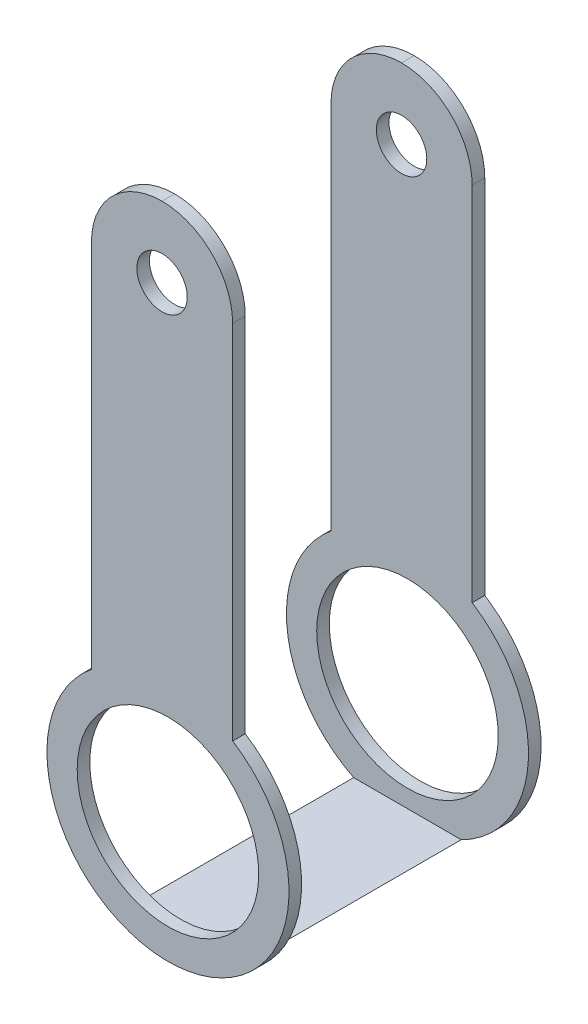
ISO-10303-21;
HEADER;
FILE_DESCRIPTION(('STEP AP214'),'2;1');
FILE_NAME('part.step','',(''),(''),'','','');
FILE_SCHEMA(('AUTOMOTIVE_DESIGN { 1 0 10303 214 1 1 1 1 }'));
ENDSEC;
DATA;
#1=APPLICATION_CONTEXT('core data for automotive mechanical design processes');
#2=APPLICATION_PROTOCOL_DEFINITION('international standard','automotive_design',2000,#1);
#3=PRODUCT_CONTEXT('',#1,'mechanical');
#4=PRODUCT('Part','Part','',(#3));
#5=PRODUCT_RELATED_PRODUCT_CATEGORY('part','',(#4));
#6=PRODUCT_DEFINITION_FORMATION('','',#4);
#7=PRODUCT_DEFINITION_CONTEXT('part definition',#1,'design');
#8=PRODUCT_DEFINITION('design','',#6,#7);
#9=PRODUCT_DEFINITION_SHAPE('','',#8);
#10=(LENGTH_UNIT() NAMED_UNIT(*) SI_UNIT(.MILLI.,.METRE.));
#11=(NAMED_UNIT(*) PLANE_ANGLE_UNIT() SI_UNIT($,.RADIAN.));
#12=(NAMED_UNIT(*) SI_UNIT($,.STERADIAN.) SOLID_ANGLE_UNIT());
#13=UNCERTAINTY_MEASURE_WITH_UNIT(LENGTH_MEASURE(1.E-05),#10,'distance_accuracy_value','');
#14=(GEOMETRIC_REPRESENTATION_CONTEXT(3) GLOBAL_UNCERTAINTY_ASSIGNED_CONTEXT((#13)) GLOBAL_UNIT_ASSIGNED_CONTEXT((#10,
#11,#12)) REPRESENTATION_CONTEXT('',''));
#15=CARTESIAN_POINT('',(0.,0.,0.));
#16=DIRECTION('',(0.,0.,1.));
#17=DIRECTION('',(1.,0.,0.));
#18=AXIS2_PLACEMENT_3D('',#15,#16,#17);
#19=CARTESIAN_POINT('',(14.,65.,50.));
#20=DIRECTION('',(-1.,0.,0.));
#21=DIRECTION('',(0.,-1.,0.));
#22=AXIS2_PLACEMENT_3D('',#19,#20,#21);
#23=PLANE('',#22);
#24=DIRECTION('',(0.,0.999999999999996,9.23076923113147E-08));
#25=VECTOR('',#24,1.);
#26=CARTESIAN_POINT('',(14.,65.0000043846154,2.50000000000042));
#27=LINE('',#26,#25);
#28=CARTESIAN_POINT('',(14.,-20.7159242785124,2.49999208776085));
#29=VERTEX_POINT('',#28);
#30=CARTESIAN_POINT('',(14.,51.,2.49999870769232));
#31=VERTEX_POINT('',#30);
#32=EDGE_CURVE('E340',#29,#31,#27,.T.);
#33=ORIENTED_EDGE('',*,*,#32,.F.);
#34=DIRECTION('',(0.,0.,-1.));
#35=VECTOR('',#34,1.);
#36=CARTESIAN_POINT('',(14.,-20.7159242785124,50.));
#37=LINE('',#36,#35);
#38=CARTESIAN_POINT('',(14.,-20.7159242785124,0.));
#39=VERTEX_POINT('',#38);
#40=EDGE_CURVE('E204',#29,#39,#37,.T.);
#41=ORIENTED_EDGE('',*,*,#40,.T.);
#42=DIRECTION('',(0.,1.,0.));
#43=VECTOR('',#42,1.);
#44=CARTESIAN_POINT('',(14.,65.,0.));
#45=LINE('',#44,#43);
#46=CARTESIAN_POINT('',(14.,51.,0.));
#47=VERTEX_POINT('',#46);
#48=EDGE_CURVE('E217',#39,#47,#45,.T.);
#49=ORIENTED_EDGE('',*,*,#48,.T.);
#50=DIRECTION('',(0.,0.,-1.));
#51=VECTOR('',#50,1.);
#52=CARTESIAN_POINT('',(14.,51.,50.));
#53=LINE('',#52,#51);
#54=EDGE_CURVE('E261',#47,#31,#53,.F.);
#55=ORIENTED_EDGE('',*,*,#54,.T.);
#56=EDGE_LOOP('',(#33,#41,#49,#55));
#57=FACE_BOUND('',#56,.T.);
#58=ADVANCED_FACE('F41',(#57),#23,.F.);
#59=DIRECTION('',(0.,-1.,0.));
#60=VECTOR('',#59,1.);
#61=CARTESIAN_POINT('',(14.,65.,47.5));
#62=LINE('',#61,#60);
#63=CARTESIAN_POINT('',(14.,51.,47.5));
#64=VERTEX_POINT('',#63);
#65=CARTESIAN_POINT('',(14.,-20.7159242785124,47.5));
#66=VERTEX_POINT('',#65);
#67=EDGE_CURVE('E322',#64,#66,#62,.T.);
#68=ORIENTED_EDGE('',*,*,#67,.F.);
#69=CARTESIAN_POINT('',(14.,51.,50.));
#70=VERTEX_POINT('',#69);
#71=EDGE_CURVE('E260',#64,#70,#53,.F.);
#72=ORIENTED_EDGE('',*,*,#71,.T.);
#73=DIRECTION('',(0.,1.,0.));
#74=VECTOR('',#73,1.);
#75=CARTESIAN_POINT('',(14.,65.,50.));
#76=LINE('',#75,#74);
#77=CARTESIAN_POINT('',(14.,-20.7159242785124,50.));
#78=VERTEX_POINT('',#77);
#79=EDGE_CURVE('E218',#78,#70,#76,.T.);
#80=ORIENTED_EDGE('',*,*,#79,.F.);
#81=EDGE_CURVE('E209',#78,#66,#37,.T.);
#82=ORIENTED_EDGE('',*,*,#81,.T.);
#83=EDGE_LOOP('',(#68,#72,#80,#82));
#84=FACE_BOUND('',#83,.T.);
#85=ADVANCED_FACE('F460',(#84),#23,.F.);
#86=CARTESIAN_POINT('',(-14.,65.,50.));
#87=DIRECTION('',(1.,0.,0.));
#88=DIRECTION('',(0.,1.,0.));
#89=AXIS2_PLACEMENT_3D('',#86,#87,#88);
#90=PLANE('',#89);
#91=DIRECTION('',(0.,0.999999999999996,9.23076923113147E-08));
#92=VECTOR('',#91,1.);
#93=CARTESIAN_POINT('',(-14.,-2.30768678499285E-07,2.49999399999999));
#94=LINE('',#93,#92);
#95=CARTESIAN_POINT('',(-14.,-22.4040632285838,2.49999193193264));
#96=VERTEX_POINT('',#95);
#97=CARTESIAN_POINT('',(-14.,51.,2.49999870769232));
#98=VERTEX_POINT('',#97);
#99=EDGE_CURVE('E190',#96,#98,#94,.T.);
#100=ORIENTED_EDGE('',*,*,#99,.T.);
#101=DIRECTION('',(0.,0.,-1.));
#102=VECTOR('',#101,1.);
#103=CARTESIAN_POINT('',(-14.,51.,50.));
#104=LINE('',#103,#102);
#105=CARTESIAN_POINT('',(-14.,51.,0.));
#106=VERTEX_POINT('',#105);
#107=EDGE_CURVE('E270',#98,#106,#104,.T.);
#108=ORIENTED_EDGE('',*,*,#107,.T.);
#109=DIRECTION('',(0.,-1.,0.));
#110=VECTOR('',#109,1.);
#111=CARTESIAN_POINT('',(-14.,65.,0.));
#112=LINE('',#111,#110);
#113=CARTESIAN_POINT('',(-14.,-22.4040632285838,0.));
#114=VERTEX_POINT('',#113);
#115=EDGE_CURVE('E202',#106,#114,#112,.T.);
#116=ORIENTED_EDGE('',*,*,#115,.T.);
#117=DIRECTION('',(0.,0.,-1.));
#118=VECTOR('',#117,1.);
#119=CARTESIAN_POINT('',(-14.,-22.4040632285838,50.));
#120=LINE('',#119,#118);
#121=EDGE_CURVE('E178',#114,#96,#120,.F.);
#122=ORIENTED_EDGE('',*,*,#121,.T.);
#123=EDGE_LOOP('',(#100,#108,#116,#122));
#124=FACE_BOUND('',#123,.T.);
#125=ADVANCED_FACE('F200',(#124),#90,.F.);
#126=DIRECTION('',(0.,-1.,0.));
#127=VECTOR('',#126,1.);
#128=CARTESIAN_POINT('',(-14.,0.,47.5));
#129=LINE('',#128,#127);
#130=CARTESIAN_POINT('',(-14.,51.,47.5));
#131=VERTEX_POINT('',#130);
#132=CARTESIAN_POINT('',(-14.,-22.4040632285838,47.5));
#133=VERTEX_POINT('',#132);
#134=EDGE_CURVE('E197',#131,#133,#129,.T.);
#135=ORIENTED_EDGE('',*,*,#134,.T.);
#136=CARTESIAN_POINT('',(-14.,-22.4040632285838,50.));
#137=VERTEX_POINT('',#136);
#138=EDGE_CURVE('E205',#133,#137,#120,.F.);
#139=ORIENTED_EDGE('',*,*,#138,.T.);
#140=DIRECTION('',(0.,-1.,0.));
#141=VECTOR('',#140,1.);
#142=CARTESIAN_POINT('',(-14.,65.,50.));
#143=LINE('',#142,#141);
#144=CARTESIAN_POINT('',(-14.,51.,50.));
#145=VERTEX_POINT('',#144);
#146=EDGE_CURVE('E222',#145,#137,#143,.T.);
#147=ORIENTED_EDGE('',*,*,#146,.F.);
#148=EDGE_CURVE('E271',#145,#131,#104,.T.);
#149=ORIENTED_EDGE('',*,*,#148,.T.);
#150=EDGE_LOOP('',(#135,#139,#147,#149));
#151=FACE_BOUND('',#150,.T.);
#152=ADVANCED_FACE('F419',(#151),#90,.F.);
#153=CARTESIAN_POINT('',(1.17205113336667,-41.,50.));
#154=DIRECTION('',(0.,0.,-1.));
#155=DIRECTION('',(-1.,0.,0.));
#156=AXIS2_PLACEMENT_3D('',#153,#154,#155);
#157=CYLINDRICAL_SURFACE('',#156,24.);
#158=CARTESIAN_POINT('',(1.17205113336667,-41.,2.49999021538463));
#159=DIRECTION('',(0.,-9.23076923113147E-08,0.999999999999996));
#160=DIRECTION('',(0.,-0.999999999999996,-9.23076923113147E-08));
#161=AXIS2_PLACEMENT_3D('',#158,#159,#160);
#162=CIRCLE('',#161,24.);
#163=CARTESIAN_POINT('',(-9.4933133704841,-62.5,2.49998823076924));
#164=VERTEX_POINT('',#163);
#165=EDGE_CURVE('E173',#164,#96,#162,.F.);
#166=ORIENTED_EDGE('',*,*,#165,.T.);
#167=ORIENTED_EDGE('',*,*,#121,.F.);
#168=CARTESIAN_POINT('',(1.17205113336667,-41.,0.));
#169=DIRECTION('',(0.,0.,1.));
#170=DIRECTION('',(1.,0.,0.));
#171=AXIS2_PLACEMENT_3D('',#168,#169,#170);
#172=CIRCLE('',#171,24.);
#173=EDGE_CURVE('E231',#39,#114,#172,.T.);
#174=ORIENTED_EDGE('',*,*,#173,.F.);
#175=ORIENTED_EDGE('',*,*,#40,.F.);
#176=CARTESIAN_POINT('',(14.0000000000001,-61.2840757214874,2.49998834300841));
#177=VERTEX_POINT('',#176);
#178=EDGE_CURVE('E188',#29,#177,#162,.F.);
#179=ORIENTED_EDGE('',*,*,#178,.T.);
#180=DIRECTION('',(0.,0.,-1.));
#181=VECTOR('',#180,1.);
#182=CARTESIAN_POINT('',(14.,-61.2840757214875,50.));
#183=LINE('',#182,#181);
#184=CARTESIAN_POINT('',(14.,-61.2840757214875,0.));
#185=VERTEX_POINT('',#184);
#186=EDGE_CURVE('E211',#185,#177,#183,.F.);
#187=ORIENTED_EDGE('',*,*,#186,.F.);
#188=CARTESIAN_POINT('',(13.9899713352299,-61.2904145275218,0.));
#189=VERTEX_POINT('',#188);
#190=EDGE_CURVE('E225',#189,#185,#172,.T.);
#191=ORIENTED_EDGE('',*,*,#190,.F.);
#192=CARTESIAN_POINT('',(1.17205113336667,-41.,-1.20000000006226E-05));
#193=DIRECTION('',(0.,0.,-1.));
#194=DIRECTION('',(-1.,0.,0.));
#195=AXIS2_PLACEMENT_3D('',#192,#193,#194);
#196=CIRCLE('',#195,24.);
#197=EDGE_CURVE('E236',#189,#189,#196,.T.);
#198=ORIENTED_EDGE('',*,*,#197,.F.);
#199=CARTESIAN_POINT('',(1.17205113336667,-41.,0.));
#200=DIRECTION('',(0.,0.,-1.));
#201=DIRECTION('',(-1.,0.,0.));
#202=AXIS2_PLACEMENT_3D('',#199,#200,#201);
#203=CIRCLE('',#202,24.);
#204=CARTESIAN_POINT('',(13.9,-61.3469731814923,0.));
#205=VERTEX_POINT('',#204);
#206=EDGE_CURVE('E249',#205,#189,#203,.F.);
#207=ORIENTED_EDGE('',*,*,#206,.F.);
#208=DIRECTION('',(0.,0.,-1.));
#209=VECTOR('',#208,1.);
#210=CARTESIAN_POINT('',(13.9,-61.3469731814923,50.));
#211=LINE('',#210,#209);
#212=CARTESIAN_POINT('',(13.9,-61.3469731814923,2.49998833720249));
#213=VERTEX_POINT('',#212);
#214=EDGE_CURVE('E245',#205,#213,#211,.F.);
#215=ORIENTED_EDGE('',*,*,#214,.T.);
#216=CARTESIAN_POINT('',(11.8374156372174,-62.5,2.49998823076924));
#217=VERTEX_POINT('',#216);
#218=EDGE_CURVE('E186',#213,#217,#162,.F.);
#219=ORIENTED_EDGE('',*,*,#218,.T.);
#220=DIRECTION('',(0.,0.,-1.));
#221=VECTOR('',#220,1.);
#222=CARTESIAN_POINT('',(11.8374156372174,-62.5,50.));
#223=LINE('',#222,#221);
#224=CARTESIAN_POINT('',(11.8374156372174,-62.5,47.5));
#225=VERTEX_POINT('',#224);
#226=EDGE_CURVE('E12',#225,#217,#223,.T.);
#227=ORIENTED_EDGE('',*,*,#226,.F.);
#228=CARTESIAN_POINT('',(1.17205113336667,-41.,47.5));
#229=DIRECTION('',(0.,0.,-1.));
#230=DIRECTION('',(-1.,0.,0.));
#231=AXIS2_PLACEMENT_3D('',#228,#229,#230);
#232=CIRCLE('',#231,24.);
#233=CARTESIAN_POINT('',(13.9,-61.3469731814923,47.5));
#234=VERTEX_POINT('',#233);
#235=EDGE_CURVE('E331',#225,#234,#232,.F.);
#236=ORIENTED_EDGE('',*,*,#235,.T.);
#237=CARTESIAN_POINT('',(13.9,-61.3469731814923,50.));
#238=VERTEX_POINT('',#237);
#239=EDGE_CURVE('E235',#234,#238,#211,.F.);
#240=ORIENTED_EDGE('',*,*,#239,.T.);
#241=CARTESIAN_POINT('',(1.17205113336667,-41.,50.));
#242=DIRECTION('',(0.,0.,-1.));
#243=DIRECTION('',(-1.,0.,0.));
#244=AXIS2_PLACEMENT_3D('',#241,#242,#243);
#245=CIRCLE('',#244,24.);
#246=EDGE_CURVE('E367',#238,#137,#245,.T.);
#247=ORIENTED_EDGE('',*,*,#246,.T.);
#248=ORIENTED_EDGE('',*,*,#138,.F.);
#249=CARTESIAN_POINT('',(-9.4933133704841,-62.5,47.5));
#250=VERTEX_POINT('',#249);
#251=EDGE_CURVE('E330',#133,#250,#232,.F.);
#252=ORIENTED_EDGE('',*,*,#251,.T.);
#253=DIRECTION('',(0.,0.,-1.));
#254=VECTOR('',#253,1.);
#255=CARTESIAN_POINT('',(-9.49331337048411,-62.5,50.));
#256=LINE('',#255,#254);
#257=EDGE_CURVE('E51',#164,#250,#256,.F.);
#258=ORIENTED_EDGE('',*,*,#257,.F.);
#259=EDGE_LOOP('',(#166,#167,#174,#175,#179,#187,#191,#198,#207,#215,#219,#227,#236,#240,#247,
#248,#252,#258));
#260=FACE_BOUND('',#259,.T.);
#261=ADVANCED_FACE('F175',(#260),#157,.T.);
#262=CARTESIAN_POINT('',(14.,-61.2840757214875,47.5));
#263=VERTEX_POINT('',#262);
#264=CARTESIAN_POINT('',(14.,-61.2840757214875,50.));
#265=VERTEX_POINT('',#264);
#266=EDGE_CURVE('E377',#263,#265,#183,.F.);
#267=ORIENTED_EDGE('',*,*,#266,.F.);
#268=EDGE_CURVE('E325',#263,#66,#232,.F.);
#269=ORIENTED_EDGE('',*,*,#268,.T.);
#270=ORIENTED_EDGE('',*,*,#81,.F.);
#271=EDGE_CURVE('E372',#78,#265,#245,.T.);
#272=ORIENTED_EDGE('',*,*,#271,.T.);
#273=EDGE_LOOP('',(#267,#269,#270,#272));
#274=FACE_BOUND('',#273,.T.);
#275=ADVANCED_FACE('F489',(#274),#157,.T.);
#276=CARTESIAN_POINT('',(13.9,-61.2840757214875,0.));
#277=DIRECTION('',(0.,1.,0.));
#278=DIRECTION('',(-1.,0.,0.));
#279=AXIS2_PLACEMENT_3D('',#276,#277,#278);
#280=PLANE('',#279);
#281=DIRECTION('',(1.,0.,0.));
#282=VECTOR('',#281,1.);
#283=CARTESIAN_POINT('',(13.9,-61.2840757214875,2.49998834300841));
#284=LINE('',#283,#282);
#285=CARTESIAN_POINT('',(13.9,-61.2840757214875,2.49998834300841));
#286=VERTEX_POINT('',#285);
#287=EDGE_CURVE('E345',#286,#177,#284,.T.);
#288=ORIENTED_EDGE('',*,*,#287,.F.);
#289=DIRECTION('',(0.,0.,1.));
#290=VECTOR('',#289,1.);
#291=CARTESIAN_POINT('',(13.9,-61.2840757214875,0.));
#292=LINE('',#291,#290);
#293=CARTESIAN_POINT('',(13.9,-61.2840757214875,0.));
#294=VERTEX_POINT('',#293);
#295=EDGE_CURVE('E352',#294,#286,#292,.T.);
#296=ORIENTED_EDGE('',*,*,#295,.F.);
#297=DIRECTION('',(1.,0.,0.));
#298=VECTOR('',#297,1.);
#299=CARTESIAN_POINT('',(13.9,-61.2840757214875,0.));
#300=LINE('',#299,#298);
#301=EDGE_CURVE('E364',#294,#185,#300,.T.);
#302=ORIENTED_EDGE('',*,*,#301,.T.);
#303=ORIENTED_EDGE('',*,*,#186,.T.);
#304=EDGE_LOOP('',(#288,#296,#302,#303));
#305=FACE_BOUND('',#304,.T.);
#306=ADVANCED_FACE('F390',(#305),#280,.F.);
#307=DIRECTION('',(-1.,0.,0.));
#308=VECTOR('',#307,1.);
#309=CARTESIAN_POINT('',(13.9,-61.2840757214875,47.5));
#310=LINE('',#309,#308);
#311=CARTESIAN_POINT('',(13.9,-61.2840757214875,47.5));
#312=VERTEX_POINT('',#311);
#313=EDGE_CURVE('E329',#263,#312,#310,.T.);
#314=ORIENTED_EDGE('',*,*,#313,.F.);
#315=ORIENTED_EDGE('',*,*,#266,.T.);
#316=DIRECTION('',(1.,0.,0.));
#317=VECTOR('',#316,1.);
#318=CARTESIAN_POINT('',(13.9,-61.2840757214875,50.));
#319=LINE('',#318,#317);
#320=CARTESIAN_POINT('',(13.9,-61.2840757214875,50.));
#321=VERTEX_POINT('',#320);
#322=EDGE_CURVE('E363',#321,#265,#319,.T.);
#323=ORIENTED_EDGE('',*,*,#322,.F.);
#324=EDGE_CURVE('E280',#312,#321,#292,.T.);
#325=ORIENTED_EDGE('',*,*,#324,.F.);
#326=EDGE_LOOP('',(#314,#315,#323,#325));
#327=FACE_BOUND('',#326,.T.);
#328=ADVANCED_FACE('F484',(#327),#280,.F.);
#329=CARTESIAN_POINT('',(13.9,0.,0.));
#330=DIRECTION('',(1.,0.,0.));
#331=DIRECTION('',(0.,0.,-1.));
#332=AXIS2_PLACEMENT_3D('',#329,#330,#331);
#333=PLANE('',#332);
#334=ORIENTED_EDGE('',*,*,#295,.T.);
#335=DIRECTION('',(0.,-0.999999999999996,-9.23076923113147E-08));
#336=VECTOR('',#335,1.);
#337=CARTESIAN_POINT('',(13.9,-2.30768676942808E-07,2.49999399999999));
#338=LINE('',#337,#336);
#339=EDGE_CURVE('E348',#286,#213,#338,.T.);
#340=ORIENTED_EDGE('',*,*,#339,.T.);
#341=ORIENTED_EDGE('',*,*,#214,.F.);
#342=DIRECTION('',(0.,1.,0.));
#343=VECTOR('',#342,1.);
#344=CARTESIAN_POINT('',(13.9,-65.,0.));
#345=LINE('',#344,#343);
#346=EDGE_CURVE('E360',#205,#294,#345,.T.);
#347=ORIENTED_EDGE('',*,*,#346,.T.);
#348=EDGE_LOOP('',(#334,#340,#341,#347));
#349=FACE_BOUND('',#348,.T.);
#350=ADVANCED_FACE('F437',(#349),#333,.T.);
#351=ORIENTED_EDGE('',*,*,#239,.F.);
#352=DIRECTION('',(0.,1.,0.));
#353=VECTOR('',#352,1.);
#354=CARTESIAN_POINT('',(13.9,0.,47.5));
#355=LINE('',#354,#353);
#356=EDGE_CURVE('E334',#234,#312,#355,.T.);
#357=ORIENTED_EDGE('',*,*,#356,.T.);
#358=ORIENTED_EDGE('',*,*,#324,.T.);
#359=DIRECTION('',(0.,-1.,0.));
#360=VECTOR('',#359,1.);
#361=CARTESIAN_POINT('',(13.9,-61.2840757214875,50.));
#362=LINE('',#361,#360);
#363=EDGE_CURVE('E356',#321,#238,#362,.T.);
#364=ORIENTED_EDGE('',*,*,#363,.T.);
#365=EDGE_LOOP('',(#351,#357,#358,#364));
#366=FACE_BOUND('',#365,.T.);
#367=ADVANCED_FACE('F414',(#366),#333,.T.);
#368=CARTESIAN_POINT('',(0.,51.,50.));
#369=DIRECTION('',(0.,0.,-1.));
#370=DIRECTION('',(-1.,0.,0.));
#371=AXIS2_PLACEMENT_3D('',#368,#369,#370);
#372=CYLINDRICAL_SURFACE('',#371,14.);
#373=ORIENTED_EDGE('',*,*,#107,.F.);
#374=CARTESIAN_POINT('',(0.,51.,2.49999870769232));
#375=DIRECTION('',(0.,-9.23076923113147E-08,0.999999999999996));
#376=DIRECTION('',(0.,-0.999999999999996,-9.23076923113147E-08));
#377=AXIS2_PLACEMENT_3D('',#374,#375,#376);
#378=CIRCLE('',#377,14.);
#379=CARTESIAN_POINT('',(0.,64.9999997692308,2.49999999999999));
#380=VERTEX_POINT('',#379);
#381=EDGE_CURVE('E193',#98,#380,#378,.F.);
#382=ORIENTED_EDGE('',*,*,#381,.T.);
#383=DIRECTION('',(0.,0.,-1.));
#384=VECTOR('',#383,1.);
#385=CARTESIAN_POINT('',(0.,65.,50.));
#386=LINE('',#385,#384);
#387=CARTESIAN_POINT('',(0.,65.,0.));
#388=VERTEX_POINT('',#387);
#389=EDGE_CURVE('E276',#388,#380,#386,.F.);
#390=ORIENTED_EDGE('',*,*,#389,.F.);
#391=CARTESIAN_POINT('',(0.,51.,0.));
#392=DIRECTION('',(0.,0.,1.));
#393=DIRECTION('',(1.,0.,0.));
#394=AXIS2_PLACEMENT_3D('',#391,#392,#393);
#395=CIRCLE('',#394,14.);
#396=EDGE_CURVE('E252',#106,#388,#395,.F.);
#397=ORIENTED_EDGE('',*,*,#396,.F.);
#398=EDGE_LOOP('',(#373,#382,#390,#397));
#399=FACE_BOUND('',#398,.T.);
#400=ADVANCED_FACE('F43',(#399),#372,.T.);
#401=CARTESIAN_POINT('',(0.,65.,47.5));
#402=VERTEX_POINT('',#401);
#403=CARTESIAN_POINT('',(0.,65.,50.));
#404=VERTEX_POINT('',#403);
#405=EDGE_CURVE('E185',#402,#404,#386,.F.);
#406=ORIENTED_EDGE('',*,*,#405,.F.);
#407=CARTESIAN_POINT('',(0.,51.,47.5));
#408=DIRECTION('',(0.,0.,-1.));
#409=DIRECTION('',(-1.,0.,0.));
#410=AXIS2_PLACEMENT_3D('',#407,#408,#409);
#411=CIRCLE('',#410,14.);
#412=EDGE_CURVE('E59',#402,#131,#411,.F.);
#413=ORIENTED_EDGE('',*,*,#412,.T.);
#414=ORIENTED_EDGE('',*,*,#148,.F.);
#415=CARTESIAN_POINT('',(0.,51.,50.));
#416=DIRECTION('',(0.,0.,1.));
#417=DIRECTION('',(1.,0.,0.));
#418=AXIS2_PLACEMENT_3D('',#415,#416,#417);
#419=CIRCLE('',#418,14.);
#420=EDGE_CURVE('E67',#404,#145,#419,.T.);
#421=ORIENTED_EDGE('',*,*,#420,.F.);
#422=EDGE_LOOP('',(#406,#413,#414,#421));
#423=FACE_BOUND('',#422,.T.);
#424=ADVANCED_FACE('F422',(#423),#372,.T.);
#425=CARTESIAN_POINT('',(0.,51.,50.));
#426=DIRECTION('',(0.,0.,-1.));
#427=DIRECTION('',(-1.,0.,0.));
#428=AXIS2_PLACEMENT_3D('',#425,#426,#427);
#429=CYLINDRICAL_SURFACE('',#428,14.);
#430=ORIENTED_EDGE('',*,*,#389,.T.);
#431=CARTESIAN_POINT('',(0.,51.,2.49999870769232));
#432=DIRECTION('',(0.,-9.23076923113147E-08,0.999999999999996));
#433=DIRECTION('',(0.,-0.999999999999996,-9.23076923113147E-08));
#434=AXIS2_PLACEMENT_3D('',#431,#432,#433);
#435=CIRCLE('',#434,14.);
#436=EDGE_CURVE('E283',#380,#31,#435,.F.);
#437=ORIENTED_EDGE('',*,*,#436,.T.);
#438=ORIENTED_EDGE('',*,*,#54,.F.);
#439=CARTESIAN_POINT('',(0.,51.,0.));
#440=DIRECTION('',(0.,0.,1.));
#441=DIRECTION('',(1.,0.,0.));
#442=AXIS2_PLACEMENT_3D('',#439,#440,#441);
#443=CIRCLE('',#442,14.);
#444=EDGE_CURVE('E257',#388,#47,#443,.F.);
#445=ORIENTED_EDGE('',*,*,#444,.F.);
#446=EDGE_LOOP('',(#430,#437,#438,#445));
#447=FACE_BOUND('',#446,.T.);
#448=ADVANCED_FACE('F402',(#447),#429,.T.);
#449=ORIENTED_EDGE('',*,*,#71,.F.);
#450=CARTESIAN_POINT('',(0.,51.,47.5));
#451=DIRECTION('',(0.,0.,-1.));
#452=DIRECTION('',(-1.,0.,0.));
#453=AXIS2_PLACEMENT_3D('',#450,#451,#452);
#454=CIRCLE('',#453,14.);
#455=EDGE_CURVE('E275',#64,#402,#454,.F.);
#456=ORIENTED_EDGE('',*,*,#455,.T.);
#457=ORIENTED_EDGE('',*,*,#405,.T.);
#458=CARTESIAN_POINT('',(0.,51.,50.));
#459=DIRECTION('',(0.,0.,1.));
#460=DIRECTION('',(1.,0.,0.));
#461=AXIS2_PLACEMENT_3D('',#458,#459,#460);
#462=CIRCLE('',#461,14.);
#463=EDGE_CURVE('E267',#70,#404,#462,.T.);
#464=ORIENTED_EDGE('',*,*,#463,.F.);
#465=EDGE_LOOP('',(#449,#456,#457,#464));
#466=FACE_BOUND('',#465,.T.);
#467=ADVANCED_FACE('F469',(#466),#429,.T.);
#468=CARTESIAN_POINT('',(0.,0.,50.));
#469=DIRECTION('',(0.,0.,1.));
#470=DIRECTION('',(1.,0.,0.));
#471=AXIS2_PLACEMENT_3D('',#468,#469,#470);
#472=PLANE('',#471);
#473=CARTESIAN_POINT('',(1.17205113336667,-41.,50.));
#474=DIRECTION('',(0.,0.,-1.));
#475=DIRECTION('',(-1.,0.,0.));
#476=AXIS2_PLACEMENT_3D('',#473,#474,#475);
#477=CIRCLE('',#476,18.);
#478=CARTESIAN_POINT('',(-16.8279488666333,-41.,50.));
#479=VERTEX_POINT('',#478);
#480=EDGE_CURVE('E667',#479,#479,#477,.T.);
#481=ORIENTED_EDGE('',*,*,#480,.T.);
#482=EDGE_LOOP('',(#481));
#483=FACE_BOUND('',#482,.T.);
#484=CARTESIAN_POINT('',(0.,51.,50.));
#485=DIRECTION('',(0.,0.,-1.));
#486=DIRECTION('',(-1.,0.,0.));
#487=AXIS2_PLACEMENT_3D('',#484,#485,#486);
#488=CIRCLE('',#487,5.);
#489=CARTESIAN_POINT('',(-5.,51.,50.));
#490=VERTEX_POINT('',#489);
#491=EDGE_CURVE('E291',#490,#490,#488,.T.);
#492=ORIENTED_EDGE('',*,*,#491,.T.);
#493=EDGE_LOOP('',(#492));
#494=FACE_BOUND('',#493,.T.);
#495=ORIENTED_EDGE('',*,*,#79,.T.);
#496=ORIENTED_EDGE('',*,*,#463,.T.);
#497=ORIENTED_EDGE('',*,*,#420,.T.);
#498=ORIENTED_EDGE('',*,*,#146,.T.);
#499=ORIENTED_EDGE('',*,*,#246,.F.);
#500=ORIENTED_EDGE('',*,*,#363,.F.);
#501=ORIENTED_EDGE('',*,*,#322,.T.);
#502=ORIENTED_EDGE('',*,*,#271,.F.);
#503=EDGE_LOOP('',(#495,#496,#497,#498,#499,#500,#501,#502));
#504=FACE_BOUND('',#503,.T.);
#505=ADVANCED_FACE('F416',(#483,#494,#504),#472,.T.);
#506=CARTESIAN_POINT('',(0.,0.,0.));
#507=DIRECTION('',(0.,0.,1.));
#508=DIRECTION('',(1.,0.,0.));
#509=AXIS2_PLACEMENT_3D('',#506,#507,#508);
#510=PLANE('',#509);
#511=CARTESIAN_POINT('',(0.,51.,0.));
#512=DIRECTION('',(0.,0.,-1.));
#513=DIRECTION('',(-1.,0.,0.));
#514=AXIS2_PLACEMENT_3D('',#511,#512,#513);
#515=CIRCLE('',#514,5.);
#516=CARTESIAN_POINT('',(-5.,51.,0.));
#517=VERTEX_POINT('',#516);
#518=EDGE_CURVE('E299',#517,#517,#515,.T.);
#519=ORIENTED_EDGE('',*,*,#518,.F.);
#520=EDGE_LOOP('',(#519));
#521=FACE_BOUND('',#520,.T.);
#522=ORIENTED_EDGE('',*,*,#396,.T.);
#523=ORIENTED_EDGE('',*,*,#444,.T.);
#524=ORIENTED_EDGE('',*,*,#48,.F.);
#525=ORIENTED_EDGE('',*,*,#173,.T.);
#526=ORIENTED_EDGE('',*,*,#115,.F.);
#527=EDGE_LOOP('',(#522,#523,#524,#525,#526));
#528=FACE_BOUND('',#527,.T.);
#529=ADVANCED_FACE('F444',(#521,#528),#510,.F.);
#530=CARTESIAN_POINT('',(1.17205113336667,-41.,-1.2E-05));
#531=DIRECTION('',(0.,0.,-1.));
#532=DIRECTION('',(-1.,0.,0.));
#533=AXIS2_PLACEMENT_3D('',#530,#531,#532);
#534=PLANE('',#533);
#535=CARTESIAN_POINT('',(1.17205113336667,-41.,-1.2E-05));
#536=DIRECTION('',(0.,0.,-1.));
#537=DIRECTION('',(-1.,0.,0.));
#538=AXIS2_PLACEMENT_3D('',#535,#536,#537);
#539=CIRCLE('',#538,18.);
#540=CARTESIAN_POINT('',(-16.8279488666333,-41.,-1.2E-05));
#541=VERTEX_POINT('',#540);
#542=EDGE_CURVE('E665',#541,#541,#539,.T.);
#543=ORIENTED_EDGE('',*,*,#542,.F.);
#544=EDGE_LOOP('',(#543));
#545=FACE_BOUND('',#544,.T.);
#546=ORIENTED_EDGE('',*,*,#197,.T.);
#547=EDGE_LOOP('',(#546));
#548=FACE_BOUND('',#547,.T.);
#549=ADVANCED_FACE('F442',(#545,#548),#534,.T.);
#550=CARTESIAN_POINT('',(13.9,-65.,0.));
#551=DIRECTION('',(0.,0.,-1.));
#552=DIRECTION('',(-1.,0.,0.));
#553=AXIS2_PLACEMENT_3D('',#550,#551,#552);
#554=PLANE('',#553);
#555=ORIENTED_EDGE('',*,*,#190,.T.);
#556=ORIENTED_EDGE('',*,*,#301,.F.);
#557=ORIENTED_EDGE('',*,*,#346,.F.);
#558=ORIENTED_EDGE('',*,*,#206,.T.);
#559=EDGE_LOOP('',(#555,#556,#557,#558));
#560=FACE_BOUND('',#559,.T.);
#561=ADVANCED_FACE('F440',(#560),#554,.F.);
#562=CARTESIAN_POINT('',(25.1720761333667,-2.30768674317579E-07,2.49999399999999));
#563=DIRECTION('',(0.,-9.23076923113147E-08,0.999999999999996));
#564=DIRECTION('',(0.,-0.999999999999996,-9.23076923113147E-08));
#565=AXIS2_PLACEMENT_3D('',#562,#563,#564);
#566=PLANE('',#565);
#567=CARTESIAN_POINT('',(1.17205113336667,-41.,2.49999021538463));
#568=DIRECTION('',(0.,-9.23076923113147E-08,0.999999999999996));
#569=DIRECTION('',(0.,-0.999999999999996,-9.23076923113147E-08));
#570=AXIS2_PLACEMENT_3D('',#567,#568,#569);
#571=CIRCLE('',#570,18.);
#572=CARTESIAN_POINT('',(1.17205113336667,-58.9999999999999,2.49998855384617));
#573=VERTEX_POINT('',#572);
#574=EDGE_CURVE('E305',#573,#573,#571,.T.);
#575=ORIENTED_EDGE('',*,*,#574,.F.);
#576=EDGE_LOOP('',(#575));
#577=FACE_BOUND('',#576,.T.);
#578=CARTESIAN_POINT('',(0.,51.,2.49999870769232));
#579=DIRECTION('',(0.,-9.23076923113147E-08,0.999999999999996));
#580=DIRECTION('',(0.,-0.999999999999996,-9.23076923113147E-08));
#581=AXIS2_PLACEMENT_3D('',#578,#579,#580);
#582=CIRCLE('',#581,5.);
#583=CARTESIAN_POINT('',(0.,46.,2.49999824615386));
#584=VERTEX_POINT('',#583);
#585=EDGE_CURVE('E198',#584,#584,#582,.T.);
#586=ORIENTED_EDGE('',*,*,#585,.F.);
#587=EDGE_LOOP('',(#586));
#588=FACE_BOUND('',#587,.T.);
#589=DIRECTION('',(-1.,0.,0.));
#590=VECTOR('',#589,1.);
#591=CARTESIAN_POINT('',(25.1720761333667,-62.5,2.49998823076924));
#592=LINE('',#591,#590);
#593=EDGE_CURVE('E313',#217,#164,#592,.T.);
#594=ORIENTED_EDGE('',*,*,#593,.F.);
#595=ORIENTED_EDGE('',*,*,#218,.F.);
#596=ORIENTED_EDGE('',*,*,#339,.F.);
#597=ORIENTED_EDGE('',*,*,#287,.T.);
#598=ORIENTED_EDGE('',*,*,#178,.F.);
#599=ORIENTED_EDGE('',*,*,#32,.T.);
#600=ORIENTED_EDGE('',*,*,#436,.F.);
#601=ORIENTED_EDGE('',*,*,#381,.F.);
#602=ORIENTED_EDGE('',*,*,#99,.F.);
#603=ORIENTED_EDGE('',*,*,#165,.F.);
#604=EDGE_LOOP('',(#594,#595,#596,#597,#598,#599,#600,#601,#602,#603));
#605=FACE_BOUND('',#604,.T.);
#606=ADVANCED_FACE('F191',(#577,#588,#605),#566,.T.);
#607=CARTESIAN_POINT('',(25.1720761333667,0.,47.5));
#608=DIRECTION('',(0.,0.,-1.));
#609=DIRECTION('',(-1.,0.,0.));
#610=AXIS2_PLACEMENT_3D('',#607,#608,#609);
#611=PLANE('',#610);
#612=CARTESIAN_POINT('',(1.17205113336667,-41.,47.5));
#613=DIRECTION('',(0.,0.,-1.));
#614=DIRECTION('',(-1.,0.,0.));
#615=AXIS2_PLACEMENT_3D('',#612,#613,#614);
#616=CIRCLE('',#615,18.);
#617=CARTESIAN_POINT('',(-16.8279488666333,-41.,47.5));
#618=VERTEX_POINT('',#617);
#619=EDGE_CURVE('E45',#618,#618,#616,.T.);
#620=ORIENTED_EDGE('',*,*,#619,.F.);
#621=EDGE_LOOP('',(#620));
#622=FACE_BOUND('',#621,.T.);
#623=CARTESIAN_POINT('',(0.,51.,47.5));
#624=DIRECTION('',(0.,0.,-1.));
#625=DIRECTION('',(-1.,0.,0.));
#626=AXIS2_PLACEMENT_3D('',#623,#624,#625);
#627=CIRCLE('',#626,5.);
#628=CARTESIAN_POINT('',(-5.,51.,47.5));
#629=VERTEX_POINT('',#628);
#630=EDGE_CURVE('E288',#629,#629,#627,.T.);
#631=ORIENTED_EDGE('',*,*,#630,.F.);
#632=EDGE_LOOP('',(#631));
#633=FACE_BOUND('',#632,.T.);
#634=ORIENTED_EDGE('',*,*,#251,.F.);
#635=ORIENTED_EDGE('',*,*,#134,.F.);
#636=ORIENTED_EDGE('',*,*,#412,.F.);
#637=ORIENTED_EDGE('',*,*,#455,.F.);
#638=ORIENTED_EDGE('',*,*,#67,.T.);
#639=ORIENTED_EDGE('',*,*,#268,.F.);
#640=ORIENTED_EDGE('',*,*,#313,.T.);
#641=ORIENTED_EDGE('',*,*,#356,.F.);
#642=ORIENTED_EDGE('',*,*,#235,.F.);
#643=DIRECTION('',(-1.,0.,0.));
#644=VECTOR('',#643,1.);
#645=CARTESIAN_POINT('',(25.1720761333667,-62.5,47.5));
#646=LINE('',#645,#644);
#647=EDGE_CURVE('E314',#225,#250,#646,.T.);
#648=ORIENTED_EDGE('',*,*,#647,.T.);
#649=EDGE_LOOP('',(#634,#635,#636,#637,#638,#639,#640,#641,#642,#648));
#650=FACE_BOUND('',#649,.T.);
#651=ADVANCED_FACE('F431',(#622,#633,#650),#611,.T.);
#652=CARTESIAN_POINT('',(25.1720761333667,-62.5,0.));
#653=DIRECTION('',(0.,-1.,0.));
#654=DIRECTION('',(1.,0.,0.));
#655=AXIS2_PLACEMENT_3D('',#652,#653,#654);
#656=PLANE('',#655);
#657=ORIENTED_EDGE('',*,*,#257,.T.);
#658=ORIENTED_EDGE('',*,*,#647,.F.);
#659=ORIENTED_EDGE('',*,*,#226,.T.);
#660=ORIENTED_EDGE('',*,*,#593,.T.);
#661=EDGE_LOOP('',(#657,#658,#659,#660));
#662=FACE_BOUND('',#661,.T.);
#663=ADVANCED_FACE('F434',(#662),#656,.F.);
#664=CARTESIAN_POINT('',(0.,51.,50.));
#665=DIRECTION('',(0.,0.,-1.));
#666=DIRECTION('',(-1.,0.,0.));
#667=AXIS2_PLACEMENT_3D('',#664,#665,#666);
#668=CYLINDRICAL_SURFACE('',#667,5.);
#669=ORIENTED_EDGE('',*,*,#630,.T.);
#670=EDGE_LOOP('',(#669));
#671=FACE_BOUND('',#670,.T.);
#672=ORIENTED_EDGE('',*,*,#491,.F.);
#673=EDGE_LOOP('',(#672));
#674=FACE_BOUND('',#673,.T.);
#675=ADVANCED_FACE('F508',(#671,#674),#668,.F.);
#676=ORIENTED_EDGE('',*,*,#585,.T.);
#677=EDGE_LOOP('',(#676));
#678=FACE_BOUND('',#677,.T.);
#679=ORIENTED_EDGE('',*,*,#518,.T.);
#680=EDGE_LOOP('',(#679));
#681=FACE_BOUND('',#680,.T.);
#682=ADVANCED_FACE('F629',(#678,#681),#668,.F.);
#683=CARTESIAN_POINT('',(1.17205113336667,-41.,50.));
#684=DIRECTION('',(0.,0.,-1.));
#685=DIRECTION('',(-1.,0.,0.));
#686=AXIS2_PLACEMENT_3D('',#683,#684,#685);
#687=CYLINDRICAL_SURFACE('',#686,18.);
#688=ORIENTED_EDGE('',*,*,#619,.T.);
#689=EDGE_LOOP('',(#688));
#690=FACE_BOUND('',#689,.T.);
#691=ORIENTED_EDGE('',*,*,#480,.F.);
#692=EDGE_LOOP('',(#691));
#693=FACE_BOUND('',#692,.T.);
#694=ADVANCED_FACE('F637',(#690,#693),#687,.F.);
#695=ORIENTED_EDGE('',*,*,#574,.T.);
#696=EDGE_LOOP('',(#695));
#697=FACE_BOUND('',#696,.T.);
#698=ORIENTED_EDGE('',*,*,#542,.T.);
#699=EDGE_LOOP('',(#698));
#700=FACE_BOUND('',#699,.T.);
#701=ADVANCED_FACE('F644',(#697,#700),#687,.F.);
#702=CLOSED_SHELL('',(#58,#85,#125,#152,#261,#275,#306,#328,#350,#367,#400,#424,#448,#467,#505,
#529,#549,#561,#606,#651,#663,#675,#682,#694,#701));
#703=MANIFOLD_SOLID_BREP('B2',#702);
#704=ADVANCED_BREP_SHAPE_REPRESENTATION('',(#18,#703),#14);
#705=SHAPE_DEFINITION_REPRESENTATION(#9,#704);
ENDSEC;
END-ISO-10303-21;
